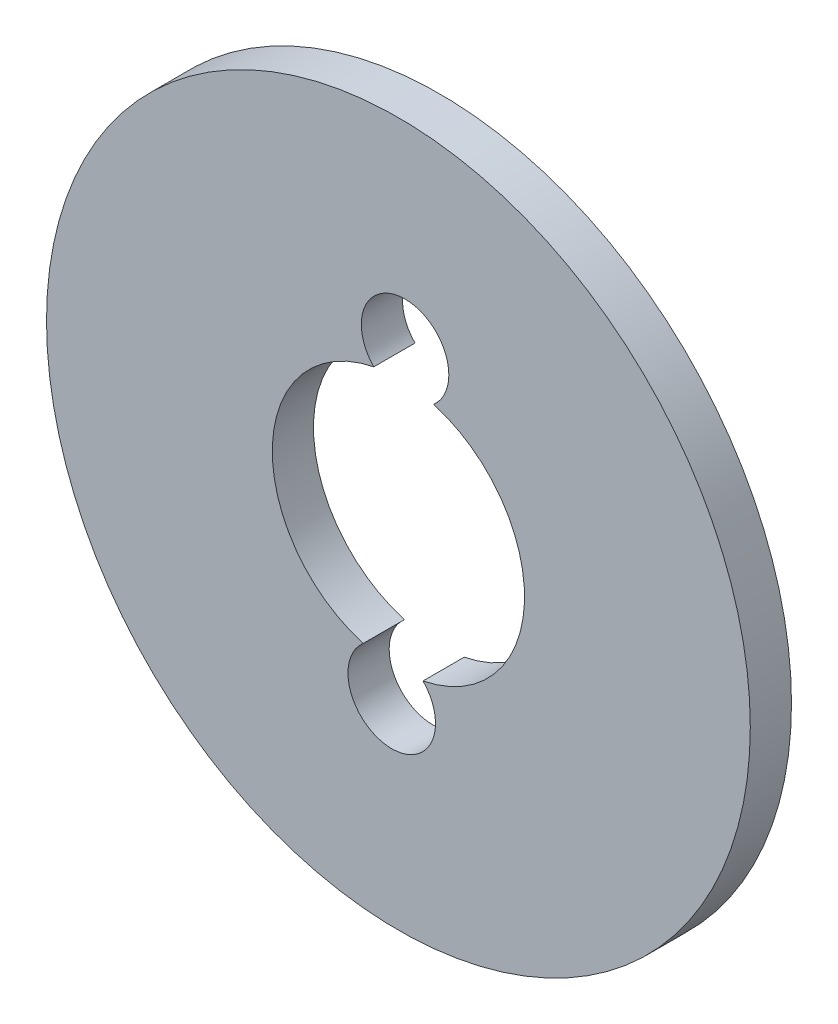
ISO-10303-21;
HEADER;
FILE_DESCRIPTION(('STEP AP214'),'2;1');
FILE_NAME('part.step','',(''),(''),'','','');
FILE_SCHEMA(('AUTOMOTIVE_DESIGN { 1 0 10303 214 1 1 1 1 }'));
ENDSEC;
DATA;
#1=APPLICATION_CONTEXT('core data for automotive mechanical design processes');
#2=APPLICATION_PROTOCOL_DEFINITION('international standard','automotive_design',2000,#1);
#3=PRODUCT_CONTEXT('',#1,'mechanical');
#4=PRODUCT('Part','Part','',(#3));
#5=PRODUCT_RELATED_PRODUCT_CATEGORY('part','',(#4));
#6=PRODUCT_DEFINITION_FORMATION('','',#4);
#7=PRODUCT_DEFINITION_CONTEXT('part definition',#1,'design');
#8=PRODUCT_DEFINITION('design','',#6,#7);
#9=PRODUCT_DEFINITION_SHAPE('','',#8);
#10=(LENGTH_UNIT() NAMED_UNIT(*) SI_UNIT(.MILLI.,.METRE.));
#11=(NAMED_UNIT(*) PLANE_ANGLE_UNIT() SI_UNIT($,.RADIAN.));
#12=(NAMED_UNIT(*) SI_UNIT($,.STERADIAN.) SOLID_ANGLE_UNIT());
#13=UNCERTAINTY_MEASURE_WITH_UNIT(LENGTH_MEASURE(1.E-05),#10,'distance_accuracy_value','');
#14=(GEOMETRIC_REPRESENTATION_CONTEXT(3) GLOBAL_UNCERTAINTY_ASSIGNED_CONTEXT((#13)) GLOBAL_UNIT_ASSIGNED_CONTEXT((#10,
#11,#12)) REPRESENTATION_CONTEXT('',''));
#15=CARTESIAN_POINT('',(0.,0.,0.));
#16=DIRECTION('',(0.,0.,1.));
#17=DIRECTION('',(1.,0.,0.));
#18=AXIS2_PLACEMENT_3D('',#15,#16,#17);
#19=CARTESIAN_POINT('',(0.,0.,-0.8));
#20=DIRECTION('',(0.,0.,1.));
#21=DIRECTION('',(1.,0.,0.));
#22=AXIS2_PLACEMENT_3D('',#19,#20,#21);
#23=CYLINDRICAL_SURFACE('',#22,2.45);
#24=CARTESIAN_POINT('',(0.,0.,-0.8));
#25=DIRECTION('',(0.,0.,1.));
#26=DIRECTION('',(1.,0.,0.));
#27=AXIS2_PLACEMENT_3D('',#24,#25,#26);
#28=CIRCLE('',#27,2.45);
#29=CARTESIAN_POINT('',(0.478171562271875,-2.40288409146893,-0.8));
#30=VERTEX_POINT('',#29);
#31=CARTESIAN_POINT('',(0.683671515529773,2.35267789101127,-0.8));
#32=VERTEX_POINT('',#31);
#33=EDGE_CURVE('E55',#30,#32,#28,.T.);
#34=ORIENTED_EDGE('',*,*,#33,.F.);
#35=DIRECTION('',(0.,0.,-1.));
#36=VECTOR('',#35,1.);
#37=CARTESIAN_POINT('',(0.478171562271876,-2.40288409146893,-0.4));
#38=LINE('',#37,#36);
#39=CARTESIAN_POINT('',(0.478171562271875,-2.40288409146893,0.));
#40=VERTEX_POINT('',#39);
#41=EDGE_CURVE('E11',#30,#40,#38,.F.);
#42=ORIENTED_EDGE('',*,*,#41,.T.);
#43=CARTESIAN_POINT('',(0.,0.,0.));
#44=DIRECTION('',(0.,0.,1.));
#45=DIRECTION('',(1.,0.,0.));
#46=AXIS2_PLACEMENT_3D('',#43,#44,#45);
#47=CIRCLE('',#46,2.45);
#48=CARTESIAN_POINT('',(0.683671515529773,2.35267789101127,0.));
#49=VERTEX_POINT('',#48);
#50=EDGE_CURVE('E90',#40,#49,#47,.T.);
#51=ORIENTED_EDGE('',*,*,#50,.T.);
#52=DIRECTION('',(0.,0.,-1.));
#53=VECTOR('',#52,1.);
#54=CARTESIAN_POINT('',(0.683671515529773,2.35267789101127,-0.4));
#55=LINE('',#54,#53);
#56=EDGE_CURVE('E85',#49,#32,#55,.T.);
#57=ORIENTED_EDGE('',*,*,#56,.T.);
#58=EDGE_LOOP('',(#34,#42,#51,#57));
#59=FACE_BOUND('',#58,.T.);
#60=ADVANCED_FACE('F33',(#59),#23,.F.);
#61=CARTESIAN_POINT('',(0.,0.,-0.8));
#62=DIRECTION('',(0.,0.,1.));
#63=DIRECTION('',(1.,0.,0.));
#64=AXIS2_PLACEMENT_3D('',#61,#62,#63);
#65=CYLINDRICAL_SURFACE('',#64,6.83557795130821);
#66=CARTESIAN_POINT('',(0.,0.,-0.8));
#67=DIRECTION('',(0.,0.,1.));
#68=DIRECTION('',(1.,0.,0.));
#69=AXIS2_PLACEMENT_3D('',#66,#67,#68);
#70=CIRCLE('',#69,6.83557795130821);
#71=CARTESIAN_POINT('',(6.83557795130821,0.,-0.8));
#72=VERTEX_POINT('',#71);
#73=EDGE_CURVE('E96',#72,#72,#70,.T.);
#74=ORIENTED_EDGE('',*,*,#73,.T.);
#75=EDGE_LOOP('',(#74));
#76=FACE_BOUND('',#75,.T.);
#77=CARTESIAN_POINT('',(0.,0.,0.));
#78=DIRECTION('',(0.,0.,1.));
#79=DIRECTION('',(1.,0.,0.));
#80=AXIS2_PLACEMENT_3D('',#77,#78,#79);
#81=CIRCLE('',#80,6.83557795130821);
#82=CARTESIAN_POINT('',(6.83557795130821,0.,0.));
#83=VERTEX_POINT('',#82);
#84=EDGE_CURVE('E88',#83,#83,#81,.T.);
#85=ORIENTED_EDGE('',*,*,#84,.F.);
#86=EDGE_LOOP('',(#85));
#87=FACE_BOUND('',#86,.T.);
#88=ADVANCED_FACE('F35',(#76,#87),#65,.T.);
#89=CARTESIAN_POINT('',(0.,0.,-0.8));
#90=DIRECTION('',(0.,0.,1.));
#91=DIRECTION('',(1.,0.,0.));
#92=AXIS2_PLACEMENT_3D('',#89,#90,#91);
#93=PLANE('',#92);
#94=CARTESIAN_POINT('',(-0.478171562271875,2.40288409146893,-0.8));
#95=VERTEX_POINT('',#94);
#96=CARTESIAN_POINT('',(-0.683671515529773,-2.35267789101127,-0.8));
#97=VERTEX_POINT('',#96);
#98=EDGE_CURVE('E81',#95,#97,#28,.T.);
#99=ORIENTED_EDGE('',*,*,#98,.T.);
#100=CARTESIAN_POINT('',(-0.129516777263381,-2.99720293013458,-0.8));
#101=DIRECTION('',(0.,0.,-1.));
#102=DIRECTION('',(-1.,0.,0.));
#103=AXIS2_PLACEMENT_3D('',#100,#101,#102);
#104=CIRCLE('',#103,0.85);
#105=EDGE_CURVE('E48',#30,#97,#104,.T.);
#106=ORIENTED_EDGE('',*,*,#105,.F.);
#107=ORIENTED_EDGE('',*,*,#33,.T.);
#108=CARTESIAN_POINT('',(0.129516777263381,2.99720293013458,-0.8));
#109=DIRECTION('',(0.,0.,-1.));
#110=DIRECTION('',(-1.,0.,0.));
#111=AXIS2_PLACEMENT_3D('',#108,#109,#110);
#112=CIRCLE('',#111,0.85);
#113=EDGE_CURVE('E93',#95,#32,#112,.T.);
#114=ORIENTED_EDGE('',*,*,#113,.F.);
#115=EDGE_LOOP('',(#99,#106,#107,#114));
#116=FACE_BOUND('',#115,.T.);
#117=ORIENTED_EDGE('',*,*,#73,.F.);
#118=EDGE_LOOP('',(#117));
#119=FACE_BOUND('',#118,.T.);
#120=ADVANCED_FACE('F78',(#116,#119),#93,.F.);
#121=CARTESIAN_POINT('',(0.,0.,0.));
#122=DIRECTION('',(0.,0.,1.));
#123=DIRECTION('',(1.,0.,0.));
#124=AXIS2_PLACEMENT_3D('',#121,#122,#123);
#125=PLANE('',#124);
#126=CARTESIAN_POINT('',(-0.129516777263381,-2.99720293013458,0.));
#127=DIRECTION('',(0.,0.,-1.));
#128=DIRECTION('',(-1.,0.,0.));
#129=AXIS2_PLACEMENT_3D('',#126,#127,#128);
#130=CIRCLE('',#129,0.85);
#131=CARTESIAN_POINT('',(-0.683671515529773,-2.35267789101127,0.));
#132=VERTEX_POINT('',#131);
#133=EDGE_CURVE('E74',#40,#132,#130,.T.);
#134=ORIENTED_EDGE('',*,*,#133,.T.);
#135=CARTESIAN_POINT('',(-0.478171562271875,2.40288409146893,0.));
#136=VERTEX_POINT('',#135);
#137=EDGE_CURVE('E86',#136,#132,#47,.T.);
#138=ORIENTED_EDGE('',*,*,#137,.F.);
#139=CARTESIAN_POINT('',(0.129516777263381,2.99720293013458,0.));
#140=DIRECTION('',(0.,0.,-1.));
#141=DIRECTION('',(-1.,0.,0.));
#142=AXIS2_PLACEMENT_3D('',#139,#140,#141);
#143=CIRCLE('',#142,0.85);
#144=EDGE_CURVE('E112',#136,#49,#143,.T.);
#145=ORIENTED_EDGE('',*,*,#144,.T.);
#146=ORIENTED_EDGE('',*,*,#50,.F.);
#147=EDGE_LOOP('',(#134,#138,#145,#146));
#148=FACE_BOUND('',#147,.T.);
#149=ORIENTED_EDGE('',*,*,#84,.T.);
#150=EDGE_LOOP('',(#149));
#151=FACE_BOUND('',#150,.T.);
#152=ADVANCED_FACE('F108',(#148,#151),#125,.T.);
#153=ORIENTED_EDGE('',*,*,#137,.T.);
#154=DIRECTION('',(0.,0.,-1.));
#155=VECTOR('',#154,1.);
#156=CARTESIAN_POINT('',(-0.683671515529773,-2.35267789101127,-0.4));
#157=LINE('',#156,#155);
#158=EDGE_CURVE('E41',#132,#97,#157,.T.);
#159=ORIENTED_EDGE('',*,*,#158,.T.);
#160=ORIENTED_EDGE('',*,*,#98,.F.);
#161=DIRECTION('',(0.,0.,-1.));
#162=VECTOR('',#161,1.);
#163=CARTESIAN_POINT('',(-0.478171562271876,2.40288409146893,-0.4));
#164=LINE('',#163,#162);
#165=EDGE_CURVE('E102',#95,#136,#164,.F.);
#166=ORIENTED_EDGE('',*,*,#165,.T.);
#167=EDGE_LOOP('',(#153,#159,#160,#166));
#168=FACE_BOUND('',#167,.T.);
#169=ADVANCED_FACE('F105',(#168),#23,.F.);
#170=CARTESIAN_POINT('',(0.129516777263381,2.99720293013458,0.));
#171=DIRECTION('',(0.,0.,-1.));
#172=DIRECTION('',(-1.,0.,0.));
#173=AXIS2_PLACEMENT_3D('',#170,#171,#172);
#174=CYLINDRICAL_SURFACE('',#173,0.85);
#175=ORIENTED_EDGE('',*,*,#113,.T.);
#176=ORIENTED_EDGE('',*,*,#56,.F.);
#177=ORIENTED_EDGE('',*,*,#144,.F.);
#178=ORIENTED_EDGE('',*,*,#165,.F.);
#179=EDGE_LOOP('',(#175,#176,#177,#178));
#180=FACE_BOUND('',#179,.T.);
#181=ADVANCED_FACE('F114',(#180),#174,.F.);
#182=CARTESIAN_POINT('',(-0.129516777263381,-2.99720293013458,0.));
#183=DIRECTION('',(0.,0.,-1.));
#184=DIRECTION('',(-1.,0.,0.));
#185=AXIS2_PLACEMENT_3D('',#182,#183,#184);
#186=CYLINDRICAL_SURFACE('',#185,0.85);
#187=ORIENTED_EDGE('',*,*,#105,.T.);
#188=ORIENTED_EDGE('',*,*,#158,.F.);
#189=ORIENTED_EDGE('',*,*,#133,.F.);
#190=ORIENTED_EDGE('',*,*,#41,.F.);
#191=EDGE_LOOP('',(#187,#188,#189,#190));
#192=FACE_BOUND('',#191,.T.);
#193=ADVANCED_FACE('F72',(#192),#186,.F.);
#194=CLOSED_SHELL('',(#60,#88,#120,#152,#169,#181,#193));
#195=MANIFOLD_SOLID_BREP('B2',#194);
#196=ADVANCED_BREP_SHAPE_REPRESENTATION('',(#18,#195),#14);
#197=SHAPE_DEFINITION_REPRESENTATION(#9,#196);
ENDSEC;
END-ISO-10303-21;
